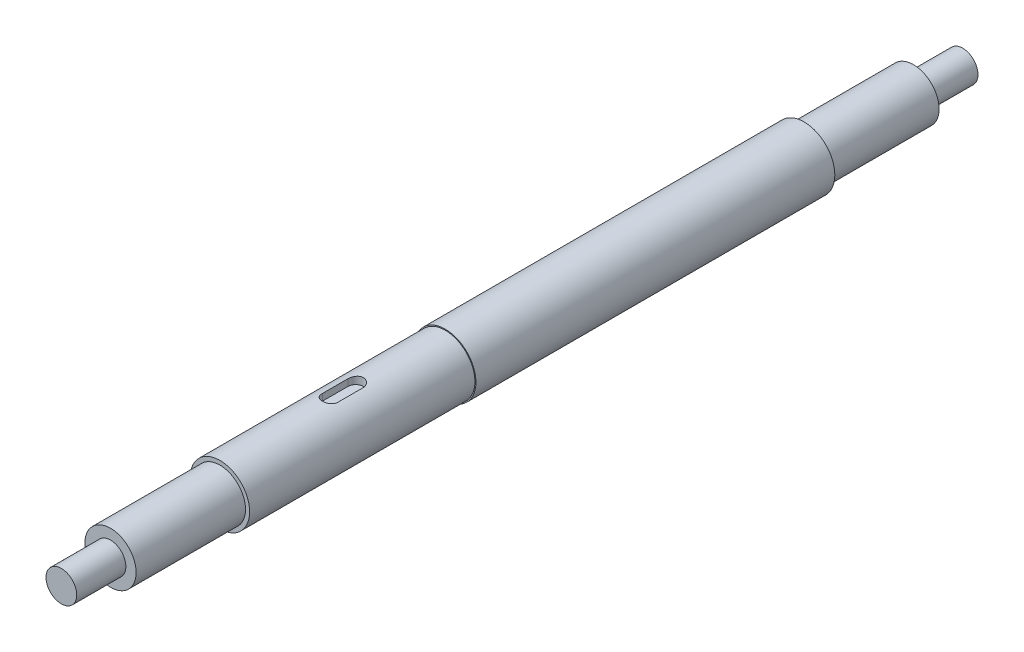
ISO-10303-21;
HEADER;
FILE_DESCRIPTION(('STEP AP214'),'2;1');
FILE_NAME('part.step','',(''),(''),'','','');
FILE_SCHEMA(('AUTOMOTIVE_DESIGN { 1 0 10303 214 1 1 1 1 }'));
ENDSEC;
DATA;
#1=APPLICATION_CONTEXT('core data for automotive mechanical design processes');
#2=APPLICATION_PROTOCOL_DEFINITION('international standard','automotive_design',2000,#1);
#3=PRODUCT_CONTEXT('',#1,'mechanical');
#4=PRODUCT('Part','Part','',(#3));
#5=PRODUCT_RELATED_PRODUCT_CATEGORY('part','',(#4));
#6=PRODUCT_DEFINITION_FORMATION('','',#4);
#7=PRODUCT_DEFINITION_CONTEXT('part definition',#1,'design');
#8=PRODUCT_DEFINITION('design','',#6,#7);
#9=PRODUCT_DEFINITION_SHAPE('','',#8);
#10=(LENGTH_UNIT() NAMED_UNIT(*) SI_UNIT(.MILLI.,.METRE.));
#11=(NAMED_UNIT(*) PLANE_ANGLE_UNIT() SI_UNIT($,.RADIAN.));
#12=(NAMED_UNIT(*) SI_UNIT($,.STERADIAN.) SOLID_ANGLE_UNIT());
#13=UNCERTAINTY_MEASURE_WITH_UNIT(LENGTH_MEASURE(1.E-05),#10,'distance_accuracy_value','');
#14=(GEOMETRIC_REPRESENTATION_CONTEXT(3) GLOBAL_UNCERTAINTY_ASSIGNED_CONTEXT((#13)) GLOBAL_UNIT_ASSIGNED_CONTEXT((#10,
#11,#12)) REPRESENTATION_CONTEXT('',''));
#15=CARTESIAN_POINT('',(0.,0.,0.));
#16=DIRECTION('',(0.,0.,1.));
#17=DIRECTION('',(1.,0.,0.));
#18=AXIS2_PLACEMENT_3D('',#15,#16,#17);
#19=CARTESIAN_POINT('',(0.,0.,139.7));
#20=DIRECTION('',(0.,0.,-1.));
#21=DIRECTION('',(-1.,0.,0.));
#22=AXIS2_PLACEMENT_3D('',#19,#20,#21);
#23=CYLINDRICAL_SURFACE('',#22,9.525);
#24=CARTESIAN_POINT('',(0.,0.,-90.551));
#25=DIRECTION('',(0.,0.,1.));
#26=DIRECTION('',(1.,0.,0.));
#27=AXIS2_PLACEMENT_3D('',#24,#25,#26);
#28=CIRCLE('',#27,9.525);
#29=CARTESIAN_POINT('',(9.525,0.,-90.551));
#30=VERTEX_POINT('',#29);
#31=EDGE_CURVE('E131',#30,#30,#28,.T.);
#32=ORIENTED_EDGE('',*,*,#31,.T.);
#33=EDGE_LOOP('',(#32));
#34=FACE_BOUND('',#33,.T.);
#35=CARTESIAN_POINT('',(0.,0.,20.701));
#36=DIRECTION('',(0.,0.,1.));
#37=DIRECTION('',(1.,0.,0.));
#38=AXIS2_PLACEMENT_3D('',#35,#36,#37);
#39=CIRCLE('',#38,9.525);
#40=CARTESIAN_POINT('',(9.525,0.,20.701));
#41=VERTEX_POINT('',#40);
#42=EDGE_CURVE('E105',#41,#41,#39,.T.);
#43=ORIENTED_EDGE('',*,*,#42,.F.);
#44=EDGE_LOOP('',(#43));
#45=FACE_BOUND('',#44,.T.);
#46=ADVANCED_FACE('F32',(#34,#45),#23,.T.);
#47=CARTESIAN_POINT('',(0.,0.,-139.701));
#48=DIRECTION('',(0.,0.,1.));
#49=DIRECTION('',(1.,0.,0.));
#50=AXIS2_PLACEMENT_3D('',#47,#48,#49);
#51=CYLINDRICAL_SURFACE('',#50,7.9375);
#52=CARTESIAN_POINT('',(0.,0.,-90.551));
#53=DIRECTION('',(0.,0.,1.));
#54=DIRECTION('',(1.,0.,0.));
#55=AXIS2_PLACEMENT_3D('',#52,#53,#54);
#56=CIRCLE('',#55,7.9375);
#57=CARTESIAN_POINT('',(7.9375,0.,-90.551));
#58=VERTEX_POINT('',#57);
#59=EDGE_CURVE('E126',#58,#58,#56,.T.);
#60=ORIENTED_EDGE('',*,*,#59,.F.);
#61=EDGE_LOOP('',(#60));
#62=FACE_BOUND('',#61,.T.);
#63=CARTESIAN_POINT('',(0.,0.,-124.46));
#64=DIRECTION('',(0.,0.,1.));
#65=DIRECTION('',(1.,0.,0.));
#66=AXIS2_PLACEMENT_3D('',#63,#64,#65);
#67=CIRCLE('',#66,7.9375);
#68=CARTESIAN_POINT('',(7.9375,0.,-124.46));
#69=VERTEX_POINT('',#68);
#70=EDGE_CURVE('E114',#69,#69,#67,.T.);
#71=ORIENTED_EDGE('',*,*,#70,.T.);
#72=EDGE_LOOP('',(#71));
#73=FACE_BOUND('',#72,.T.);
#74=ADVANCED_FACE('F167',(#62,#73),#51,.T.);
#75=CARTESIAN_POINT('',(0.,0.,-90.551));
#76=DIRECTION('',(0.,0.,-1.));
#77=DIRECTION('',(1.,0.,0.));
#78=AXIS2_PLACEMENT_3D('',#75,#76,#77);
#79=PLANE('',#78);
#80=ORIENTED_EDGE('',*,*,#59,.T.);
#81=EDGE_LOOP('',(#80));
#82=FACE_BOUND('',#81,.T.);
#83=ORIENTED_EDGE('',*,*,#31,.F.);
#84=EDGE_LOOP('',(#83));
#85=FACE_BOUND('',#84,.T.);
#86=ADVANCED_FACE('F174',(#82,#85),#79,.T.);
#87=CARTESIAN_POINT('',(0.,0.,-139.701));
#88=DIRECTION('',(0.,0.,1.));
#89=DIRECTION('',(1.,0.,0.));
#90=AXIS2_PLACEMENT_3D('',#87,#88,#89);
#91=CYLINDRICAL_SURFACE('',#90,4.7625);
#92=CARTESIAN_POINT('',(0.,0.,-124.46));
#93=DIRECTION('',(0.,0.,1.));
#94=DIRECTION('',(1.,0.,0.));
#95=AXIS2_PLACEMENT_3D('',#92,#93,#94);
#96=CIRCLE('',#95,4.7625);
#97=CARTESIAN_POINT('',(4.7625,0.,-124.46));
#98=VERTEX_POINT('',#97);
#99=EDGE_CURVE('E111',#98,#98,#96,.T.);
#100=CARTESIAN_POINT('',(0.,0.,-139.7));
#101=DIRECTION('',(0.,0.,1.));
#102=DIRECTION('',(1.,0.,0.));
#103=AXIS2_PLACEMENT_3D('',#100,#101,#102);
#104=CIRCLE('',#103,4.7625);
#105=CARTESIAN_POINT('',(4.7625,0.,-139.7));
#106=VERTEX_POINT('',#105);
#107=EDGE_CURVE('E110',#106,#106,#104,.F.);
#108=CARTESIAN_POINT('',(4.7625,0.,-124.46));
#109=CARTESIAN_POINT('',(4.7625,0.,-124.61875));
#110=CARTESIAN_POINT('',(4.7625,0.,-124.7775));
#111=CARTESIAN_POINT('',(4.7625,0.,-125.095));
#112=CARTESIAN_POINT('',(4.7625,0.,-125.25375));
#113=CARTESIAN_POINT('',(4.7625,0.,-125.57125));
#114=CARTESIAN_POINT('',(4.7625,0.,-125.73));
#115=CARTESIAN_POINT('',(4.7625,0.,-126.0475));
#116=CARTESIAN_POINT('',(4.7625,0.,-126.20625));
#117=CARTESIAN_POINT('',(4.7625,0.,-126.52375));
#118=CARTESIAN_POINT('',(4.7625,0.,-126.6825));
#119=CARTESIAN_POINT('',(4.7625,0.,-127.));
#120=CARTESIAN_POINT('',(4.7625,0.,-127.15875));
#121=CARTESIAN_POINT('',(4.7625,0.,-127.47625));
#122=CARTESIAN_POINT('',(4.7625,0.,-127.635));
#123=CARTESIAN_POINT('',(4.7625,0.,-127.9525));
#124=CARTESIAN_POINT('',(4.7625,0.,-128.11125));
#125=CARTESIAN_POINT('',(4.7625,0.,-128.42875));
#126=CARTESIAN_POINT('',(4.7625,0.,-128.5875));
#127=CARTESIAN_POINT('',(4.7625,0.,-128.905));
#128=CARTESIAN_POINT('',(4.7625,0.,-129.06375));
#129=CARTESIAN_POINT('',(4.7625,0.,-129.38125));
#130=CARTESIAN_POINT('',(4.7625,0.,-129.54));
#131=CARTESIAN_POINT('',(4.7625,0.,-129.8575));
#132=CARTESIAN_POINT('',(4.7625,0.,-130.01625));
#133=CARTESIAN_POINT('',(4.7625,0.,-130.33375));
#134=CARTESIAN_POINT('',(4.7625,0.,-130.4925));
#135=CARTESIAN_POINT('',(4.7625,0.,-130.81));
#136=CARTESIAN_POINT('',(4.7625,0.,-130.96875));
#137=CARTESIAN_POINT('',(4.7625,0.,-131.28625));
#138=CARTESIAN_POINT('',(4.7625,0.,-131.445));
#139=CARTESIAN_POINT('',(4.7625,0.,-131.7625));
#140=CARTESIAN_POINT('',(4.7625,0.,-131.92125));
#141=CARTESIAN_POINT('',(4.7625,0.,-132.23875));
#142=CARTESIAN_POINT('',(4.7625,0.,-132.3975));
#143=CARTESIAN_POINT('',(4.7625,0.,-132.715));
#144=CARTESIAN_POINT('',(4.7625,0.,-132.87375));
#145=CARTESIAN_POINT('',(4.7625,0.,-133.19125));
#146=CARTESIAN_POINT('',(4.7625,0.,-133.35));
#147=CARTESIAN_POINT('',(4.7625,0.,-133.6675));
#148=CARTESIAN_POINT('',(4.7625,0.,-133.82625));
#149=CARTESIAN_POINT('',(4.7625,0.,-134.14375));
#150=CARTESIAN_POINT('',(4.7625,0.,-134.3025));
#151=CARTESIAN_POINT('',(4.7625,0.,-134.62));
#152=CARTESIAN_POINT('',(4.7625,0.,-134.77875));
#153=CARTESIAN_POINT('',(4.7625,0.,-135.09625));
#154=CARTESIAN_POINT('',(4.7625,0.,-135.255));
#155=CARTESIAN_POINT('',(4.7625,0.,-135.5725));
#156=CARTESIAN_POINT('',(4.7625,0.,-135.73125));
#157=CARTESIAN_POINT('',(4.7625,0.,-136.04875));
#158=CARTESIAN_POINT('',(4.7625,0.,-136.2075));
#159=CARTESIAN_POINT('',(4.7625,0.,-136.525));
#160=CARTESIAN_POINT('',(4.7625,0.,-136.68375));
#161=CARTESIAN_POINT('',(4.7625,0.,-137.00125));
#162=CARTESIAN_POINT('',(4.7625,0.,-137.16));
#163=CARTESIAN_POINT('',(4.7625,0.,-137.4775));
#164=CARTESIAN_POINT('',(4.7625,0.,-137.63625));
#165=CARTESIAN_POINT('',(4.7625,0.,-137.95375));
#166=CARTESIAN_POINT('',(4.7625,0.,-138.1125));
#167=CARTESIAN_POINT('',(4.7625,0.,-138.43));
#168=CARTESIAN_POINT('',(4.7625,0.,-138.58875));
#169=CARTESIAN_POINT('',(4.7625,0.,-138.90625));
#170=CARTESIAN_POINT('',(4.7625,0.,-139.065));
#171=CARTESIAN_POINT('',(4.7625,0.,-139.3825));
#172=CARTESIAN_POINT('',(4.7625,0.,-139.54125));
#173=CARTESIAN_POINT('',(4.7625,0.,-139.7));
#174=B_SPLINE_CURVE_WITH_KNOTS('',3,(#108,#109,#110,#111,#112,#113,#114,#115,#116,#117,#118,
#119,#120,#121,#122,#123,#124,#125,#126,#127,#128,#129,#130,#131,#132,#133,#134,#135,#136,#137,
#138,#139,#140,#141,#142,#143,#144,#145,#146,#147,#148,#149,#150,#151,#152,#153,#154,#155,#156,
#157,#158,#159,#160,#161,#162,#163,#164,#165,#166,#167,#168,#169,#170,#171,#172,#173),
.UNSPECIFIED.,.F.,.F.,(4,2,2,2,2,2,2,2,2,2,2,2,2,2,2,2,2,2,2,2,2,2,2,2,2,2,2,2,2,2,2,2,4),(0.,
0.476249999999998,0.952500000000009,1.42874999999999,1.905,2.38125000000002,2.8575,
3.33375000000001,3.80999999999999,4.28625000000001,4.76250000000002,5.23875,5.71500000000001,
6.19125,6.66750000000001,7.14375000000002,7.62,8.09625000000001,8.5725,9.04875000000001,
9.52499999999999,10.00125,10.4775,10.95375,11.43,11.90625,12.3825,12.85875,13.335,13.81125,
14.2875,14.76375,15.24),.UNSPECIFIED.);
#175=EDGE_CURVE('BSEAM192',#98,#106,#174,.T.);
#176=ORIENTED_EDGE('',*,*,#99,.F.);
#177=ORIENTED_EDGE('',*,*,#107,.F.);
#178=ORIENTED_EDGE('',*,*,#175,.T.);
#179=ORIENTED_EDGE('',*,*,#175,.F.);
#180=EDGE_LOOP('',(#176,#178,#177,#179));
#181=FACE_BOUND('',#180,.T.);
#182=ADVANCED_FACE('F192',(#181),#91,.T.);
#183=CARTESIAN_POINT('',(0.,0.,-124.46));
#184=DIRECTION('',(0.,0.,-1.));
#185=DIRECTION('',(1.,0.,0.));
#186=AXIS2_PLACEMENT_3D('',#183,#184,#185);
#187=PLANE('',#186);
#188=ORIENTED_EDGE('',*,*,#99,.T.);
#189=EDGE_LOOP('',(#188));
#190=FACE_BOUND('',#189,.T.);
#191=ORIENTED_EDGE('',*,*,#70,.F.);
#192=EDGE_LOOP('',(#191));
#193=FACE_BOUND('',#192,.T.);
#194=ADVANCED_FACE('F188',(#190,#193),#187,.T.);
#195=CARTESIAN_POINT('',(0.,0.,-139.7));
#196=DIRECTION('',(0.,0.,1.));
#197=DIRECTION('',(1.,0.,0.));
#198=AXIS2_PLACEMENT_3D('',#195,#196,#197);
#199=PLANE('',#198);
#200=ORIENTED_EDGE('',*,*,#107,.T.);
#201=EDGE_LOOP('',(#200));
#202=FACE_BOUND('',#201,.T.);
#203=ADVANCED_FACE('F183',(#202),#199,.F.);
#204=CARTESIAN_POINT('',(0.,0.,20.701));
#205=DIRECTION('',(0.,0.,1.));
#206=DIRECTION('',(1.,0.,0.));
#207=AXIS2_PLACEMENT_3D('',#204,#205,#206);
#208=PLANE('',#207);
#209=CARTESIAN_POINT('',(0.,0.,20.701));
#210=DIRECTION('',(0.,0.,1.));
#211=DIRECTION('',(1.,0.,0.));
#212=AXIS2_PLACEMENT_3D('',#209,#210,#211);
#213=CIRCLE('',#212,9.2075);
#214=CARTESIAN_POINT('',(9.2075,0.,20.701));
#215=VERTEX_POINT('',#214);
#216=EDGE_CURVE('E102',#215,#215,#213,.T.);
#217=ORIENTED_EDGE('',*,*,#216,.F.);
#218=EDGE_LOOP('',(#217));
#219=FACE_BOUND('',#218,.T.);
#220=ORIENTED_EDGE('',*,*,#42,.T.);
#221=EDGE_LOOP('',(#220));
#222=FACE_BOUND('',#221,.T.);
#223=ADVANCED_FACE('F181',(#219,#222),#208,.T.);
#224=CARTESIAN_POINT('',(0.,0.,20.701));
#225=DIRECTION('',(0.,0.,1.));
#226=DIRECTION('',(1.,0.,0.));
#227=AXIS2_PLACEMENT_3D('',#224,#225,#226);
#228=CYLINDRICAL_SURFACE('',#227,9.2075);
#229=CARTESIAN_POINT('',(2.38125,8.89425121567297,48.48225));
#230=CARTESIAN_POINT('',(2.38125771348586,8.89424356706436,48.4164756926511));
#231=CARTESIAN_POINT('',(2.37852491879418,8.89498065981429,48.3507060202003));
#232=CARTESIAN_POINT('',(2.36763823875342,8.8978875825352,48.2196600743762));
#233=CARTESIAN_POINT('',(2.35948531363621,8.90005715872654,48.1543837156785));
#234=CARTESIAN_POINT('',(2.33784062040485,8.90576644191423,48.0249186435276));
#235=CARTESIAN_POINT('',(2.32435990677493,8.90930331162045,47.9607279632002));
#236=CARTESIAN_POINT('',(2.29218596871497,8.91763498922107,47.8337675796772));
#237=CARTESIAN_POINT('',(2.27349266252719,8.92242981684604,47.7709978987861));
#238=CARTESIAN_POINT('',(2.20980282652468,8.93849937973838,47.5854918069805));
#239=CARTESIAN_POINT('',(2.15717351008361,8.95146561352835,47.4654228409576));
#240=CARTESIAN_POINT('',(2.03319216065005,8.98043502555607,47.2358401374569));
#241=CARTESIAN_POINT('',(1.96183451329581,8.99643911408025,47.1263295786522));
#242=CARTESIAN_POINT('',(1.80062450860297,9.03010047090928,46.9183561497016));
#243=CARTESIAN_POINT('',(1.71041384340242,9.04778548593452,46.8201749776868));
#244=CARTESIAN_POINT('',(1.51482741246048,9.08257699909839,46.6401524960434));
#245=CARTESIAN_POINT('',(1.40944920868178,9.09968340368393,46.5583138183738));
#246=CARTESIAN_POINT('',(1.18456415560703,9.13169948151207,46.4121275066713));
#247=CARTESIAN_POINT('',(1.06486914721496,9.14657236978896,46.3480605419891));
#248=CARTESIAN_POINT('',(0.815964732047537,9.17212542603985,46.2410685969597));
#249=CARTESIAN_POINT('',(0.686757295882705,9.18280645951923,46.1981392517956));
#250=CARTESIAN_POINT('',(0.425452279575138,9.19857605821002,46.1355503735005));
#251=CARTESIAN_POINT('',(0.293477399268496,9.20378043115753,46.1154082675698));
#252=CARTESIAN_POINT('',(0.0279231085031795,9.20841462312003,46.0974490727662));
#253=CARTESIAN_POINT('',(-0.105656081507321,9.20784522664279,46.0996289509062));
#254=CARTESIAN_POINT('',(-0.367268202752264,9.20108132546764,46.1259092886337));
#255=CARTESIAN_POINT('',(-0.495357518827824,9.19502068009013,46.1494881315085));
#256=CARTESIAN_POINT('',(-0.745694524495302,9.17811228161161,46.2170562275477));
#257=CARTESIAN_POINT('',(-0.867941945480094,9.16726430862615,46.2610464182207));
#258=CARTESIAN_POINT('',(-1.10448023850211,9.14179839995526,46.3685996569398));
#259=CARTESIAN_POINT('',(-1.21868428585022,9.12714555772392,46.432345049937));
#260=CARTESIAN_POINT('',(-1.43495209823094,9.09565441793181,46.5774589828557));
#261=CARTESIAN_POINT('',(-1.53701387881997,9.0788157640757,46.6588303973328));
#262=CARTESIAN_POINT('',(-1.72920449951583,9.04420967288124,46.839657812052));
#263=CARTESIAN_POINT('',(-1.81890470799758,9.02642945394961,46.9395673878955));
#264=CARTESIAN_POINT('',(-1.98039787490007,8.99238085360134,47.1532247348536));
#265=CARTESIAN_POINT('',(-2.05218590979698,8.97611288862763,47.2669762979647));
#266=CARTESIAN_POINT('',(-2.1761236858037,8.94687858335297,47.5059934226045));
#267=CARTESIAN_POINT('',(-2.22815240418847,8.93393274226394,47.6313242742371));
#268=CARTESIAN_POINT('',(-2.31019799309474,8.91307262490125,47.889298280323));
#269=CARTESIAN_POINT('',(-2.34024784435725,8.90515081212559,48.0219301561718));
#270=CARTESIAN_POINT('',(-2.3662852449929,8.89824655158333,48.2101468852009));
#271=CARTESIAN_POINT('',(-2.3718977690307,8.89675076031221,48.2644494792488));
#272=CARTESIAN_POINT('',(-2.37937605163347,8.89475345060529,48.3732426865367));
#273=CARTESIAN_POINT('',(-2.38124780695851,8.89425034083586,48.4277328583486));
#274=CARTESIAN_POINT('',(-2.38125,8.89425121567296,48.48225));
#275=B_SPLINE_CURVE_WITH_KNOTS('',3,(#229,#230,#231,#232,#233,#234,#235,#236,#237,#238,#239,
#240,#241,#242,#243,#244,#245,#246,#247,#248,#249,#250,#251,#252,#253,#254,#255,#256,#257,#258,
#259,#260,#261,#262,#263,#264,#265,#266,#267,#268,#269,#270,#271,#272,#273,#274),.UNSPECIFIED.,
.F.,.F.,(4,2,2,2,2,2,2,2,2,2,2,2,2,2,2,2,2,2,2,2,2,2,4),(0.,0.197254068815804,0.394473201353437,
0.591285259651375,0.788100405053608,1.18132316920529,1.57466394822496,1.97630011816736,
2.37800091954463,2.78572501745186,3.19336488694402,3.59220023063735,3.9909813835222,
4.38029558850088,4.76962767674342,5.16266616900512,5.55576880862756,5.96019961913445,
6.36474147348374,6.77172258767973,7.17809173986314,7.34181784851642,7.50528127953536),.UNSPECIFIED.);
#276=CARTESIAN_POINT('',(2.38125,8.89425121567297,48.48225));
#277=VERTEX_POINT('',#276);
#278=CARTESIAN_POINT('',(-2.38125,8.89425121567296,48.48225));
#279=VERTEX_POINT('',#278);
#280=EDGE_CURVE('E137',#277,#279,#275,.T.);
#281=ORIENTED_EDGE('',*,*,#280,.F.);
#282=DIRECTION('',(0.,0.,1.));
#283=VECTOR('',#282,1.);
#284=CARTESIAN_POINT('',(2.38124999999998,8.89425121567297,20.701));
#285=LINE('',#284,#283);
#286=CARTESIAN_POINT('',(2.38125,8.89425121567296,56.41975));
#287=VERTEX_POINT('',#286);
#288=EDGE_CURVE('E11',#287,#277,#285,.F.);
#289=ORIENTED_EDGE('',*,*,#288,.F.);
#290=CARTESIAN_POINT('',(-2.38125,8.89425121567296,56.41975));
#291=CARTESIAN_POINT('',(-2.38125771348586,8.89424356706436,56.4855243073489));
#292=CARTESIAN_POINT('',(-2.37852491879418,8.89498065981429,56.5512939797996));
#293=CARTESIAN_POINT('',(-2.36763823875343,8.8978875825352,56.6823399256238));
#294=CARTESIAN_POINT('',(-2.35948531363621,8.90005715872654,56.7476162843215));
#295=CARTESIAN_POINT('',(-2.33784062040486,8.90576644191423,56.8770813564724));
#296=CARTESIAN_POINT('',(-2.32435990677493,8.90930331162045,56.9412720367997));
#297=CARTESIAN_POINT('',(-2.29218596871497,8.91763498922107,57.0682324203228));
#298=CARTESIAN_POINT('',(-2.27349266252719,8.92242981684604,57.1310021012139));
#299=CARTESIAN_POINT('',(-2.20980282652468,8.93849937973838,57.3165081930195));
#300=CARTESIAN_POINT('',(-2.15717351008361,8.95146561352835,57.4365771590424));
#301=CARTESIAN_POINT('',(-2.03319216065006,8.98043502555607,57.666159862543));
#302=CARTESIAN_POINT('',(-1.96183451329581,8.99643911408025,57.7756704213478));
#303=CARTESIAN_POINT('',(-1.80062450860297,9.03010047090928,57.9836438502984));
#304=CARTESIAN_POINT('',(-1.71041384340242,9.04778548593452,58.0818250223132));
#305=CARTESIAN_POINT('',(-1.51482741246048,9.08257699909839,58.2618475039565));
#306=CARTESIAN_POINT('',(-1.40944920868178,9.09968340368393,58.3436861816262));
#307=CARTESIAN_POINT('',(-1.18456415560703,9.13169948151207,58.4898724933287));
#308=CARTESIAN_POINT('',(-1.06486914721496,9.14657236978896,58.5539394580109));
#309=CARTESIAN_POINT('',(-0.815964732047538,9.17212542603985,58.6609314030403));
#310=CARTESIAN_POINT('',(-0.686757295882706,9.18280645951923,58.7038607482044));
#311=CARTESIAN_POINT('',(-0.425452279575139,9.19857605821002,58.7664496264994));
#312=CARTESIAN_POINT('',(-0.293477399268498,9.20378043115753,58.7865917324301));
#313=CARTESIAN_POINT('',(-0.0279231085031807,9.20841462312003,58.8045509272338));
#314=CARTESIAN_POINT('',(0.10565608150732,9.20784522664279,58.8023710490938));
#315=CARTESIAN_POINT('',(0.367268202752263,9.20108132546764,58.7760907113662));
#316=CARTESIAN_POINT('',(0.495357518827823,9.19502068009013,58.7525118684915));
#317=CARTESIAN_POINT('',(0.745694524495301,9.17811228161161,58.6849437724523));
#318=CARTESIAN_POINT('',(0.867941945480093,9.16726430862615,58.6409535817793));
#319=CARTESIAN_POINT('',(1.10448023850211,9.14179839995526,58.5334003430601));
#320=CARTESIAN_POINT('',(1.21868428585022,9.12714555772392,58.469654950063));
#321=CARTESIAN_POINT('',(1.43495209823094,9.09565441793181,58.3245410171443));
#322=CARTESIAN_POINT('',(1.53701387881997,9.0788157640757,58.2431696026672));
#323=CARTESIAN_POINT('',(1.72920449951583,9.04420967288124,58.062342187948));
#324=CARTESIAN_POINT('',(1.81890470799758,9.02642945394961,57.9624326121044));
#325=CARTESIAN_POINT('',(1.98039787490007,8.99238085360134,57.7487752651463));
#326=CARTESIAN_POINT('',(2.05218590979698,8.97611288862763,57.6350237020353));
#327=CARTESIAN_POINT('',(2.1761236858037,8.94687858335297,57.3960065773955));
#328=CARTESIAN_POINT('',(2.22815240418847,8.93393274226394,57.2706757257629));
#329=CARTESIAN_POINT('',(2.31019799309474,8.91307262490125,57.012701719677));
#330=CARTESIAN_POINT('',(2.34024784435725,8.90515081212559,56.8800698438282));
#331=CARTESIAN_POINT('',(2.3662852449929,8.89824655158333,56.6918531147991));
#332=CARTESIAN_POINT('',(2.3718977690307,8.89675076031221,56.6375505207512));
#333=CARTESIAN_POINT('',(2.37937605163347,8.89475345060529,56.5287573134633));
#334=CARTESIAN_POINT('',(2.3812478069585,8.89425034083587,56.4742671416514));
#335=CARTESIAN_POINT('',(2.38125,8.89425121567296,56.41975));
#336=B_SPLINE_CURVE_WITH_KNOTS('',3,(#290,#291,#292,#293,#294,#295,#296,#297,#298,#299,#300,
#301,#302,#303,#304,#305,#306,#307,#308,#309,#310,#311,#312,#313,#314,#315,#316,#317,#318,#319,
#320,#321,#322,#323,#324,#325,#326,#327,#328,#329,#330,#331,#332,#333,#334,#335),.UNSPECIFIED.,
.F.,.F.,(4,2,2,2,2,2,2,2,2,2,2,2,2,2,2,2,2,2,2,2,2,2,4),(0.,0.197254068815804,0.394473201353437,
0.591285259651361,0.788100405053608,1.18132316920529,1.57466394822496,1.97630011816735,
2.37800091954463,2.78572501745186,3.19336488694402,3.59220023063735,3.9909813835222,
4.38029558850088,4.76962767674342,5.16266616900512,5.55576880862756,5.96019961913445,
6.36474147348374,6.77172258767972,7.17809173986314,7.34181784851642,7.50528127953536),.UNSPECIFIED.);
#337=CARTESIAN_POINT('',(-2.38125,8.89425121567296,56.41975));
#338=VERTEX_POINT('',#337);
#339=EDGE_CURVE('E39',#338,#287,#336,.T.);
#340=ORIENTED_EDGE('',*,*,#339,.F.);
#341=DIRECTION('',(0.,0.,1.));
#342=VECTOR('',#341,1.);
#343=CARTESIAN_POINT('',(-2.38125000000002,8.89425121567296,20.701));
#344=LINE('',#343,#342);
#345=EDGE_CURVE('E145',#338,#279,#344,.F.);
#346=ORIENTED_EDGE('',*,*,#345,.T.);
#347=EDGE_LOOP('',(#281,#289,#340,#346));
#348=FACE_BOUND('',#347,.T.);
#349=ORIENTED_EDGE('',*,*,#216,.T.);
#350=EDGE_LOOP('',(#349));
#351=FACE_BOUND('',#350,.T.);
#352=CARTESIAN_POINT('',(0.,0.,90.551));
#353=DIRECTION('',(0.,0.,1.));
#354=DIRECTION('',(1.,0.,0.));
#355=AXIS2_PLACEMENT_3D('',#352,#353,#354);
#356=CIRCLE('',#355,9.2075);
#357=CARTESIAN_POINT('',(9.2075,0.,90.551));
#358=VERTEX_POINT('',#357);
#359=EDGE_CURVE('E98',#358,#358,#356,.T.);
#360=ORIENTED_EDGE('',*,*,#359,.F.);
#361=EDGE_LOOP('',(#360));
#362=FACE_BOUND('',#361,.T.);
#363=ADVANCED_FACE('F146',(#348,#351,#362),#228,.T.);
#364=CARTESIAN_POINT('',(0.,0.,139.7));
#365=DIRECTION('',(0.,0.,1.));
#366=DIRECTION('',(1.,0.,0.));
#367=AXIS2_PLACEMENT_3D('',#364,#365,#366);
#368=PLANE('',#367);
#369=CARTESIAN_POINT('',(0.,0.,139.7));
#370=DIRECTION('',(0.,0.,1.));
#371=DIRECTION('',(1.,0.,0.));
#372=AXIS2_PLACEMENT_3D('',#369,#370,#371);
#373=CIRCLE('',#372,4.7625);
#374=CARTESIAN_POINT('',(-4.7625,0.,139.7));
#375=VERTEX_POINT('',#374);
#376=EDGE_CURVE('E117',#375,#375,#373,.T.);
#377=ORIENTED_EDGE('',*,*,#376,.T.);
#378=EDGE_LOOP('',(#377));
#379=FACE_BOUND('',#378,.T.);
#380=ADVANCED_FACE('F187',(#379),#368,.T.);
#381=CARTESIAN_POINT('',(0.,0.,139.701));
#382=DIRECTION('',(0.,0.,-1.));
#383=DIRECTION('',(-1.,0.,0.));
#384=AXIS2_PLACEMENT_3D('',#381,#382,#383);
#385=CYLINDRICAL_SURFACE('',#384,4.7625);
#386=CARTESIAN_POINT('',(0.,0.,124.46));
#387=DIRECTION('',(0.,0.,1.));
#388=DIRECTION('',(1.,0.,0.));
#389=AXIS2_PLACEMENT_3D('',#386,#387,#388);
#390=CIRCLE('',#389,4.7625);
#391=CARTESIAN_POINT('',(-4.7625,0.,124.46));
#392=VERTEX_POINT('',#391);
#393=EDGE_CURVE('E120',#392,#392,#390,.T.);
#394=CARTESIAN_POINT('',(-4.7625,0.,139.7));
#395=CARTESIAN_POINT('',(-4.7625,0.,139.54125));
#396=CARTESIAN_POINT('',(-4.7625,0.,139.3825));
#397=CARTESIAN_POINT('',(-4.7625,0.,139.065));
#398=CARTESIAN_POINT('',(-4.7625,0.,138.90625));
#399=CARTESIAN_POINT('',(-4.7625,0.,138.58875));
#400=CARTESIAN_POINT('',(-4.7625,0.,138.43));
#401=CARTESIAN_POINT('',(-4.7625,0.,138.1125));
#402=CARTESIAN_POINT('',(-4.7625,0.,137.95375));
#403=CARTESIAN_POINT('',(-4.7625,0.,137.63625));
#404=CARTESIAN_POINT('',(-4.7625,0.,137.4775));
#405=CARTESIAN_POINT('',(-4.7625,0.,137.16));
#406=CARTESIAN_POINT('',(-4.7625,0.,137.00125));
#407=CARTESIAN_POINT('',(-4.7625,0.,136.68375));
#408=CARTESIAN_POINT('',(-4.7625,0.,136.525));
#409=CARTESIAN_POINT('',(-4.7625,0.,136.2075));
#410=CARTESIAN_POINT('',(-4.7625,0.,136.04875));
#411=CARTESIAN_POINT('',(-4.7625,0.,135.73125));
#412=CARTESIAN_POINT('',(-4.7625,0.,135.5725));
#413=CARTESIAN_POINT('',(-4.7625,0.,135.255));
#414=CARTESIAN_POINT('',(-4.7625,0.,135.09625));
#415=CARTESIAN_POINT('',(-4.7625,0.,134.77875));
#416=CARTESIAN_POINT('',(-4.7625,0.,134.62));
#417=CARTESIAN_POINT('',(-4.7625,0.,134.3025));
#418=CARTESIAN_POINT('',(-4.7625,0.,134.14375));
#419=CARTESIAN_POINT('',(-4.7625,0.,133.82625));
#420=CARTESIAN_POINT('',(-4.7625,0.,133.6675));
#421=CARTESIAN_POINT('',(-4.7625,0.,133.35));
#422=CARTESIAN_POINT('',(-4.7625,0.,133.19125));
#423=CARTESIAN_POINT('',(-4.7625,0.,132.87375));
#424=CARTESIAN_POINT('',(-4.7625,0.,132.715));
#425=CARTESIAN_POINT('',(-4.7625,0.,132.3975));
#426=CARTESIAN_POINT('',(-4.7625,0.,132.23875));
#427=CARTESIAN_POINT('',(-4.7625,0.,131.92125));
#428=CARTESIAN_POINT('',(-4.7625,0.,131.7625));
#429=CARTESIAN_POINT('',(-4.7625,0.,131.445));
#430=CARTESIAN_POINT('',(-4.7625,0.,131.28625));
#431=CARTESIAN_POINT('',(-4.7625,0.,130.96875));
#432=CARTESIAN_POINT('',(-4.7625,0.,130.81));
#433=CARTESIAN_POINT('',(-4.7625,0.,130.4925));
#434=CARTESIAN_POINT('',(-4.7625,0.,130.33375));
#435=CARTESIAN_POINT('',(-4.7625,0.,130.01625));
#436=CARTESIAN_POINT('',(-4.7625,0.,129.8575));
#437=CARTESIAN_POINT('',(-4.7625,0.,129.54));
#438=CARTESIAN_POINT('',(-4.7625,0.,129.38125));
#439=CARTESIAN_POINT('',(-4.7625,0.,129.06375));
#440=CARTESIAN_POINT('',(-4.7625,0.,128.905));
#441=CARTESIAN_POINT('',(-4.7625,0.,128.5875));
#442=CARTESIAN_POINT('',(-4.7625,0.,128.42875));
#443=CARTESIAN_POINT('',(-4.7625,0.,128.11125));
#444=CARTESIAN_POINT('',(-4.7625,0.,127.9525));
#445=CARTESIAN_POINT('',(-4.7625,0.,127.635));
#446=CARTESIAN_POINT('',(-4.7625,0.,127.47625));
#447=CARTESIAN_POINT('',(-4.7625,0.,127.15875));
#448=CARTESIAN_POINT('',(-4.7625,0.,127.));
#449=CARTESIAN_POINT('',(-4.7625,0.,126.6825));
#450=CARTESIAN_POINT('',(-4.7625,0.,126.52375));
#451=CARTESIAN_POINT('',(-4.7625,0.,126.20625));
#452=CARTESIAN_POINT('',(-4.7625,0.,126.0475));
#453=CARTESIAN_POINT('',(-4.7625,0.,125.73));
#454=CARTESIAN_POINT('',(-4.7625,0.,125.57125));
#455=CARTESIAN_POINT('',(-4.7625,0.,125.25375));
#456=CARTESIAN_POINT('',(-4.7625,0.,125.095));
#457=CARTESIAN_POINT('',(-4.7625,0.,124.7775));
#458=CARTESIAN_POINT('',(-4.7625,0.,124.61875));
#459=CARTESIAN_POINT('',(-4.7625,0.,124.46));
#460=B_SPLINE_CURVE_WITH_KNOTS('',3,(#394,#395,#396,#397,#398,#399,#400,#401,#402,#403,#404,
#405,#406,#407,#408,#409,#410,#411,#412,#413,#414,#415,#416,#417,#418,#419,#420,#421,#422,#423,
#424,#425,#426,#427,#428,#429,#430,#431,#432,#433,#434,#435,#436,#437,#438,#439,#440,#441,#442,
#443,#444,#445,#446,#447,#448,#449,#450,#451,#452,#453,#454,#455,#456,#457,#458,#459),
.UNSPECIFIED.,.F.,.F.,(4,2,2,2,2,2,2,2,2,2,2,2,2,2,2,2,2,2,2,2,2,2,2,2,2,2,2,2,2,2,2,2,4),(0.,
0.476249999999984,0.952499999999995,1.42874999999998,1.90499999999999,2.38124999999997,
2.85749999999998,3.33374999999997,3.80999999999998,4.28624999999999,4.76249999999998,
5.23874999999999,5.71499999999997,6.19124999999998,6.66749999999996,7.14374999999998,
7.61999999999999,8.09624999999997,8.57249999999998,9.04874999999997,9.52499999999998,10.00125,
10.4775,10.95375,11.43,11.90625,12.3825,12.85875,13.335,13.81125,14.2875,14.76375,15.24),.UNSPECIFIED.);
#461=EDGE_CURVE('BSEAM199',#375,#392,#460,.T.);
#462=ORIENTED_EDGE('',*,*,#376,.F.);
#463=ORIENTED_EDGE('',*,*,#393,.T.);
#464=ORIENTED_EDGE('',*,*,#461,.T.);
#465=ORIENTED_EDGE('',*,*,#461,.F.);
#466=EDGE_LOOP('',(#462,#464,#463,#465));
#467=FACE_BOUND('',#466,.T.);
#468=ADVANCED_FACE('F199',(#467),#385,.T.);
#469=CARTESIAN_POINT('',(0.,0.,124.46));
#470=DIRECTION('',(0.,0.,1.));
#471=DIRECTION('',(1.,0.,0.));
#472=AXIS2_PLACEMENT_3D('',#469,#470,#471);
#473=PLANE('',#472);
#474=CARTESIAN_POINT('',(0.,0.,124.46));
#475=DIRECTION('',(0.,0.,1.));
#476=DIRECTION('',(1.,0.,0.));
#477=AXIS2_PLACEMENT_3D('',#474,#475,#476);
#478=CIRCLE('',#477,7.9375);
#479=CARTESIAN_POINT('',(7.9375,0.,124.46));
#480=VERTEX_POINT('',#479);
#481=EDGE_CURVE('E123',#480,#480,#478,.T.);
#482=ORIENTED_EDGE('',*,*,#481,.T.);
#483=EDGE_LOOP('',(#482));
#484=FACE_BOUND('',#483,.T.);
#485=ORIENTED_EDGE('',*,*,#393,.F.);
#486=EDGE_LOOP('',(#485));
#487=FACE_BOUND('',#486,.T.);
#488=ADVANCED_FACE('F202',(#484,#487),#473,.T.);
#489=CARTESIAN_POINT('',(0.,0.,139.701));
#490=DIRECTION('',(0.,0.,-1.));
#491=DIRECTION('',(-1.,0.,0.));
#492=AXIS2_PLACEMENT_3D('',#489,#490,#491);
#493=CYLINDRICAL_SURFACE('',#492,7.9375);
#494=CARTESIAN_POINT('',(0.,0.,90.551));
#495=DIRECTION('',(0.,0.,1.));
#496=DIRECTION('',(1.,0.,0.));
#497=AXIS2_PLACEMENT_3D('',#494,#495,#496);
#498=CIRCLE('',#497,7.9375);
#499=CARTESIAN_POINT('',(7.9375,0.,90.551));
#500=VERTEX_POINT('',#499);
#501=EDGE_CURVE('E134',#500,#500,#498,.T.);
#502=ORIENTED_EDGE('',*,*,#501,.T.);
#503=EDGE_LOOP('',(#502));
#504=FACE_BOUND('',#503,.T.);
#505=ORIENTED_EDGE('',*,*,#481,.F.);
#506=EDGE_LOOP('',(#505));
#507=FACE_BOUND('',#506,.T.);
#508=ADVANCED_FACE('F163',(#504,#507),#493,.T.);
#509=CARTESIAN_POINT('',(0.,0.,90.551));
#510=DIRECTION('',(0.,0.,1.));
#511=DIRECTION('',(1.,0.,0.));
#512=AXIS2_PLACEMENT_3D('',#509,#510,#511);
#513=PLANE('',#512);
#514=ORIENTED_EDGE('',*,*,#501,.F.);
#515=EDGE_LOOP('',(#514));
#516=FACE_BOUND('',#515,.T.);
#517=ORIENTED_EDGE('',*,*,#359,.T.);
#518=EDGE_LOOP('',(#517));
#519=FACE_BOUND('',#518,.T.);
#520=ADVANCED_FACE('F157',(#516,#519),#513,.T.);
#521=CARTESIAN_POINT('',(2.38124999999997,6.82625,0.));
#522=DIRECTION('',(1.,0.,0.));
#523=DIRECTION('',(0.,0.,-1.));
#524=AXIS2_PLACEMENT_3D('',#521,#522,#523);
#525=PLANE('',#524);
#526=ORIENTED_EDGE('',*,*,#288,.T.);
#527=DIRECTION('',(0.,1.,0.));
#528=VECTOR('',#527,1.);
#529=CARTESIAN_POINT('',(2.38125,6.82625,48.48225));
#530=LINE('',#529,#528);
#531=CARTESIAN_POINT('',(2.38125,6.82625,48.48225));
#532=VERTEX_POINT('',#531);
#533=EDGE_CURVE('E71',#532,#277,#530,.T.);
#534=ORIENTED_EDGE('',*,*,#533,.F.);
#535=DIRECTION('',(0.,0.,-1.));
#536=VECTOR('',#535,1.);
#537=CARTESIAN_POINT('',(2.38124999999997,6.82625,0.));
#538=LINE('',#537,#536);
#539=CARTESIAN_POINT('',(2.38125,6.82625,56.41975));
#540=VERTEX_POINT('',#539);
#541=EDGE_CURVE('E75',#540,#532,#538,.T.);
#542=ORIENTED_EDGE('',*,*,#541,.F.);
#543=DIRECTION('',(0.,1.,0.));
#544=VECTOR('',#543,1.);
#545=CARTESIAN_POINT('',(2.38125,6.82625,56.41975));
#546=LINE('',#545,#544);
#547=EDGE_CURVE('E96',#540,#287,#546,.T.);
#548=ORIENTED_EDGE('',*,*,#547,.T.);
#549=EDGE_LOOP('',(#526,#534,#542,#548));
#550=FACE_BOUND('',#549,.T.);
#551=ADVANCED_FACE('F73',(#550),#525,.F.);
#552=CARTESIAN_POINT('',(0.,6.82625,56.41975));
#553=DIRECTION('',(0.,1.,0.));
#554=DIRECTION('',(0.,0.,1.));
#555=AXIS2_PLACEMENT_3D('',#552,#553,#554);
#556=CYLINDRICAL_SURFACE('',#555,2.38125);
#557=DIRECTION('',(0.,1.,0.));
#558=VECTOR('',#557,1.);
#559=CARTESIAN_POINT('',(-2.38125,6.82625,56.41975));
#560=LINE('',#559,#558);
#561=CARTESIAN_POINT('',(-2.38125,6.82625,56.41975));
#562=VERTEX_POINT('',#561);
#563=EDGE_CURVE('E99',#562,#338,#560,.T.);
#564=ORIENTED_EDGE('',*,*,#563,.T.);
#565=ORIENTED_EDGE('',*,*,#339,.T.);
#566=ORIENTED_EDGE('',*,*,#547,.F.);
#567=CARTESIAN_POINT('',(0.,6.82625,56.41975));
#568=DIRECTION('',(0.,1.,0.));
#569=DIRECTION('',(0.,0.,1.));
#570=AXIS2_PLACEMENT_3D('',#567,#568,#569);
#571=CIRCLE('',#570,2.38125);
#572=EDGE_CURVE('E79',#562,#540,#571,.T.);
#573=ORIENTED_EDGE('',*,*,#572,.F.);
#574=EDGE_LOOP('',(#564,#565,#566,#573));
#575=FACE_BOUND('',#574,.T.);
#576=ADVANCED_FACE('F156',(#575),#556,.F.);
#577=CARTESIAN_POINT('',(-2.38125000000003,6.82625,0.));
#578=DIRECTION('',(1.,0.,0.));
#579=DIRECTION('',(0.,0.,-1.));
#580=AXIS2_PLACEMENT_3D('',#577,#578,#579);
#581=PLANE('',#580);
#582=ORIENTED_EDGE('',*,*,#563,.F.);
#583=DIRECTION('',(0.,0.,-1.));
#584=VECTOR('',#583,1.);
#585=CARTESIAN_POINT('',(-2.38125000000003,6.82625,0.));
#586=LINE('',#585,#584);
#587=CARTESIAN_POINT('',(-2.38125,6.82625,48.48225));
#588=VERTEX_POINT('',#587);
#589=EDGE_CURVE('E88',#562,#588,#586,.T.);
#590=ORIENTED_EDGE('',*,*,#589,.T.);
#591=DIRECTION('',(0.,1.,0.));
#592=VECTOR('',#591,1.);
#593=CARTESIAN_POINT('',(-2.38125,6.82625,48.48225));
#594=LINE('',#593,#592);
#595=EDGE_CURVE('E78',#588,#279,#594,.T.);
#596=ORIENTED_EDGE('',*,*,#595,.T.);
#597=ORIENTED_EDGE('',*,*,#345,.F.);
#598=EDGE_LOOP('',(#582,#590,#596,#597));
#599=FACE_BOUND('',#598,.T.);
#600=ADVANCED_FACE('F153',(#599),#581,.T.);
#601=CARTESIAN_POINT('',(0.,6.82625,48.48225));
#602=DIRECTION('',(0.,1.,0.));
#603=DIRECTION('',(0.,0.,1.));
#604=AXIS2_PLACEMENT_3D('',#601,#602,#603);
#605=CYLINDRICAL_SURFACE('',#604,2.38125);
#606=ORIENTED_EDGE('',*,*,#533,.T.);
#607=ORIENTED_EDGE('',*,*,#280,.T.);
#608=ORIENTED_EDGE('',*,*,#595,.F.);
#609=CARTESIAN_POINT('',(0.,6.82625,48.48225));
#610=DIRECTION('',(0.,1.,0.));
#611=DIRECTION('',(0.,0.,1.));
#612=AXIS2_PLACEMENT_3D('',#609,#610,#611);
#613=CIRCLE('',#612,2.38125);
#614=EDGE_CURVE('E83',#532,#588,#613,.T.);
#615=ORIENTED_EDGE('',*,*,#614,.F.);
#616=EDGE_LOOP('',(#606,#607,#608,#615));
#617=FACE_BOUND('',#616,.T.);
#618=ADVANCED_FACE('F84',(#617),#605,.F.);
#619=CARTESIAN_POINT('',(0.,6.82625,0.));
#620=DIRECTION('',(0.,1.,0.));
#621=DIRECTION('',(0.,0.,1.));
#622=AXIS2_PLACEMENT_3D('',#619,#620,#621);
#623=PLANE('',#622);
#624=ORIENTED_EDGE('',*,*,#541,.T.);
#625=ORIENTED_EDGE('',*,*,#614,.T.);
#626=ORIENTED_EDGE('',*,*,#589,.F.);
#627=ORIENTED_EDGE('',*,*,#572,.T.);
#628=EDGE_LOOP('',(#624,#625,#626,#627));
#629=FACE_BOUND('',#628,.T.);
#630=ADVANCED_FACE('F90',(#629),#623,.T.);
#631=CLOSED_SHELL('',(#46,#74,#86,#182,#194,#203,#223,#363,#380,#468,#488,#508,#520,#551,#576,
#600,#618,#630));
#632=MANIFOLD_SOLID_BREP('B2',#631);
#633=ADVANCED_BREP_SHAPE_REPRESENTATION('',(#18,#632),#14);
#634=SHAPE_DEFINITION_REPRESENTATION(#9,#633);
ENDSEC;
END-ISO-10303-21;
